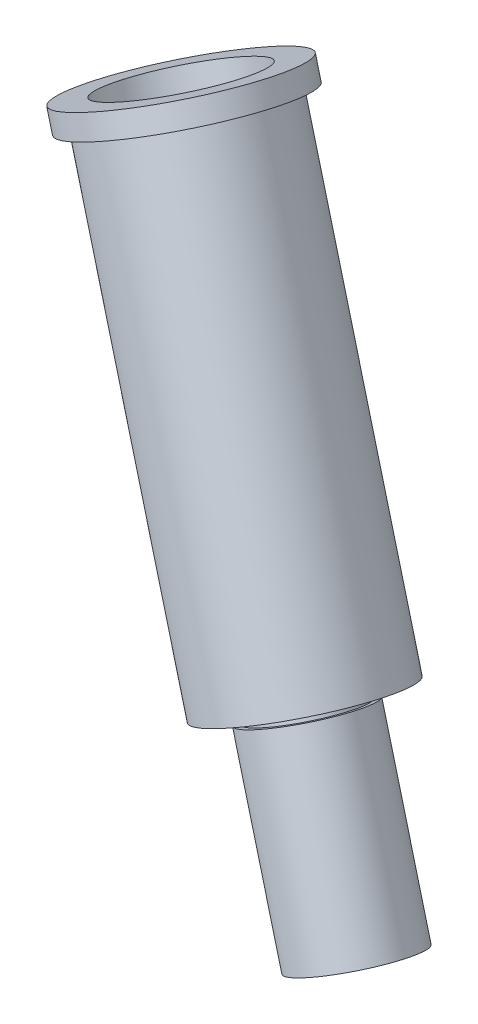
ISO-10303-21;
HEADER;
FILE_DESCRIPTION(('STEP AP214'),'2;1');
FILE_NAME('part.step','',(''),(''),'','','');
FILE_SCHEMA(('AUTOMOTIVE_DESIGN { 1 0 10303 214 1 1 1 1 }'));
ENDSEC;
DATA;
#1=APPLICATION_CONTEXT('core data for automotive mechanical design processes');
#2=APPLICATION_PROTOCOL_DEFINITION('international standard','automotive_design',2000,#1);
#3=PRODUCT_CONTEXT('',#1,'mechanical');
#4=PRODUCT('Part','Part','',(#3));
#5=PRODUCT_RELATED_PRODUCT_CATEGORY('part','',(#4));
#6=PRODUCT_DEFINITION_FORMATION('','',#4);
#7=PRODUCT_DEFINITION_CONTEXT('part definition',#1,'design');
#8=PRODUCT_DEFINITION('design','',#6,#7);
#9=PRODUCT_DEFINITION_SHAPE('','',#8);
#10=(LENGTH_UNIT() NAMED_UNIT(*) SI_UNIT(.MILLI.,.METRE.));
#11=(NAMED_UNIT(*) PLANE_ANGLE_UNIT() SI_UNIT($,.RADIAN.));
#12=(NAMED_UNIT(*) SI_UNIT($,.STERADIAN.) SOLID_ANGLE_UNIT());
#13=UNCERTAINTY_MEASURE_WITH_UNIT(LENGTH_MEASURE(1.E-05),#10,'distance_accuracy_value','');
#14=(GEOMETRIC_REPRESENTATION_CONTEXT(3) GLOBAL_UNCERTAINTY_ASSIGNED_CONTEXT((#13)) GLOBAL_UNIT_ASSIGNED_CONTEXT((#10,
#11,#12)) REPRESENTATION_CONTEXT('',''));
#15=CARTESIAN_POINT('',(0.,0.,0.));
#16=DIRECTION('',(0.,0.,1.));
#17=DIRECTION('',(1.,0.,0.));
#18=AXIS2_PLACEMENT_3D('',#15,#16,#17);
#19=CARTESIAN_POINT('',(-117.25238472882,178.239423952009,-1.86580613303616));
#20=DIRECTION('',(-0.447686282573601,0.877060581369753,-0.174188774043509));
#21=DIRECTION('',(-0.89067700354147,-0.454636641024883,0.));
#22=AXIS2_PLACEMENT_3D('',#19,#20,#21);
#23=CYLINDRICAL_SURFACE('',#22,3.17500000000134);
#24=CARTESIAN_POINT('',(-120.075761756659,183.770691703227,-2.96434455667218));
#25=DIRECTION('',(0.447686282573601,-0.877060581369753,0.174188774043509));
#26=DIRECTION('',(0.89067700354147,0.454636641024883,0.));
#27=AXIS2_PLACEMENT_3D('',#24,#25,#26);
#28=CIRCLE('',#27,3.17500000000134);
#29=CARTESIAN_POINT('',(-117.247862270413,185.214163038482,-2.96434455667218));
#30=VERTEX_POINT('',#29);
#31=EDGE_CURVE('E78',#30,#30,#28,.T.);
#32=ORIENTED_EDGE('',*,*,#31,.T.);
#33=EDGE_LOOP('',(#32));
#34=FACE_BOUND('',#33,.T.);
#35=CARTESIAN_POINT('',(-136.905184491165,216.741153078079,-9.51244895051574));
#36=DIRECTION('',(-0.447686282573601,0.877060581369753,-0.174188774043509));
#37=DIRECTION('',(-0.89067700354147,-0.454636641024883,0.));
#38=AXIS2_PLACEMENT_3D('',#35,#36,#37);
#39=CIRCLE('',#38,3.17500000000134);
#40=CARTESIAN_POINT('',(-139.733083977411,215.297681742824,-9.51244895051574));
#41=VERTEX_POINT('',#40);
#42=EDGE_CURVE('E51',#41,#41,#39,.F.);
#43=ORIENTED_EDGE('',*,*,#42,.F.);
#44=EDGE_LOOP('',(#43));
#45=FACE_BOUND('',#44,.T.);
#46=ADVANCED_FACE('F47',(#34,#45),#23,.F.);
#47=CARTESIAN_POINT('',(-153.962031857217,250.157161228268,-16.1490412415716));
#48=DIRECTION('',(0.447686282573601,-0.877060581369753,0.17418877404351));
#49=DIRECTION('',(0.89067700354147,0.454636641024883,0.));
#50=AXIS2_PLACEMENT_3D('',#47,#48,#49);
#51=CYLINDRICAL_SURFACE('',#50,11.43);
#52=CARTESIAN_POINT('',(-153.962031857217,250.157161228268,-16.1490412415716));
#53=DIRECTION('',(-0.447686282573601,0.877060581369753,-0.17418877404351));
#54=DIRECTION('',(-0.89067700354147,-0.454636641024883,0.));
#55=AXIS2_PLACEMENT_3D('',#52,#53,#54);
#56=CIRCLE('',#55,11.43);
#57=CARTESIAN_POINT('',(-164.142470007696,244.960664421354,-16.1490412415716));
#58=VERTEX_POINT('',#57);
#59=EDGE_CURVE('E62',#58,#58,#56,.T.);
#60=ORIENTED_EDGE('',*,*,#59,.F.);
#61=EDGE_LOOP('',(#60));
#62=FACE_BOUND('',#61,.T.);
#63=CARTESIAN_POINT('',(-152.82490869948,247.929427351589,-15.7066017555011));
#64=DIRECTION('',(-0.447686282573601,0.877060581369753,-0.17418877404351));
#65=DIRECTION('',(-0.89067700354147,-0.454636641024883,0.));
#66=AXIS2_PLACEMENT_3D('',#63,#64,#65);
#67=CIRCLE('',#66,11.43);
#68=CARTESIAN_POINT('',(-163.005346849959,242.732930544675,-15.7066017555011));
#69=VERTEX_POINT('',#68);
#70=EDGE_CURVE('E72',#69,#69,#67,.T.);
#71=ORIENTED_EDGE('',*,*,#70,.T.);
#72=EDGE_LOOP('',(#71));
#73=FACE_BOUND('',#72,.T.);
#74=ADVANCED_FACE('F49',(#62,#73),#51,.T.);
#75=CARTESIAN_POINT('',(-153.962031857217,250.157161228268,-16.1490412415716));
#76=DIRECTION('',(-0.447686282573601,0.877060581369753,-0.17418877404351));
#77=DIRECTION('',(-0.89067700354147,-0.454636641024883,0.));
#78=AXIS2_PLACEMENT_3D('',#75,#76,#77);
#79=PLANE('',#78);
#80=CARTESIAN_POINT('',(-153.962031857217,250.157161228268,-16.1490412415716));
#81=DIRECTION('',(-0.447686282573601,0.877060581369753,-0.174188774043509));
#82=DIRECTION('',(-0.89067700354147,-0.454636641024883,0.));
#83=AXIS2_PLACEMENT_3D('',#80,#81,#82);
#84=CIRCLE('',#83,7.9375);
#85=CARTESIAN_POINT('',(-161.031780572828,246.548482890133,-16.1490412415716));
#86=VERTEX_POINT('',#85);
#87=EDGE_CURVE('E94',#86,#86,#84,.T.);
#88=ORIENTED_EDGE('',*,*,#87,.F.);
#89=EDGE_LOOP('',(#88));
#90=FACE_BOUND('',#89,.T.);
#91=ORIENTED_EDGE('',*,*,#59,.T.);
#92=EDGE_LOOP('',(#91));
#93=FACE_BOUND('',#92,.T.);
#94=ADVANCED_FACE('F135',(#90,#93),#79,.T.);
#95=CARTESIAN_POINT('',(-152.82490869948,247.929427351589,-15.7066017555011));
#96=DIRECTION('',(-0.447686282573601,0.877060581369753,-0.17418877404351));
#97=DIRECTION('',(-0.89067700354147,-0.454636641024883,0.));
#98=AXIS2_PLACEMENT_3D('',#95,#96,#97);
#99=PLANE('',#98);
#100=CARTESIAN_POINT('',(-152.82490869948,247.929427351589,-15.7066017555011));
#101=DIRECTION('',(0.447686282573601,-0.877060581369753,0.17418877404351));
#102=DIRECTION('',(0.89067700354147,0.454636641024883,0.));
#103=AXIS2_PLACEMENT_3D('',#100,#101,#102);
#104=CIRCLE('',#103,9.99490000000001);
#105=CARTESIAN_POINT('',(-143.922681116784,252.473475114969,-15.7066017555011));
#106=VERTEX_POINT('',#105);
#107=EDGE_CURVE('E56',#106,#106,#104,.T.);
#108=ORIENTED_EDGE('',*,*,#107,.F.);
#109=EDGE_LOOP('',(#108));
#110=FACE_BOUND('',#109,.T.);
#111=ORIENTED_EDGE('',*,*,#70,.F.);
#112=EDGE_LOOP('',(#111));
#113=FACE_BOUND('',#112,.T.);
#114=ADVANCED_FACE('F159',(#110,#113),#99,.F.);
#115=CARTESIAN_POINT('',(-117.426423159589,178.580382013973,-1.93352217007332));
#116=DIRECTION('',(-0.447686282573601,0.877060581369753,-0.17418877404351));
#117=DIRECTION('',(-0.89067700354147,-0.454636641024883,0.));
#118=AXIS2_PLACEMENT_3D('',#115,#116,#117);
#119=CYLINDRICAL_SURFACE('',#118,9.99490000000001);
#120=CARTESIAN_POINT('',(-130.082445544741,203.374749818006,-6.85781203409081));
#121=DIRECTION('',(-0.447686282573601,0.877060581369753,-0.174188774043509));
#122=DIRECTION('',(-0.89067700354147,-0.454636641024883,0.));
#123=AXIS2_PLACEMENT_3D('',#120,#121,#122);
#124=CIRCLE('',#123,9.99490000000001);
#125=CARTESIAN_POINT('',(-138.984673127438,198.830702054626,-6.85781203409081));
#126=VERTEX_POINT('',#125);
#127=EDGE_CURVE('E68',#126,#126,#124,.T.);
#128=ORIENTED_EDGE('',*,*,#127,.T.);
#129=EDGE_LOOP('',(#128));
#130=FACE_BOUND('',#129,.T.);
#131=ORIENTED_EDGE('',*,*,#107,.T.);
#132=EDGE_LOOP('',(#131));
#133=FACE_BOUND('',#132,.T.);
#134=ADVANCED_FACE('F125',(#130,#133),#119,.T.);
#135=CARTESIAN_POINT('',(-130.082445544741,203.374749818006,-6.8578120340908));
#136=DIRECTION('',(-0.447686282573601,0.877060581369753,-0.174188774043509));
#137=DIRECTION('',(-0.46443243605247,-0.394533118102093,-0.792872077363687));
#138=AXIS2_PLACEMENT_3D('',#135,#136,#137);
#139=PLANE('',#138);
#140=CARTESIAN_POINT('',(-130.082445544744,203.374749818004,-6.85781203409266));
#141=DIRECTION('',(0.447686282573601,-0.877060581369753,0.174188774043509));
#142=DIRECTION('',(0.89067700354147,0.454636641024883,0.));
#143=AXIS2_PLACEMENT_3D('',#140,#141,#142);
#144=CIRCLE('',#143,5.71499999999721);
#145=CARTESIAN_POINT('',(-124.992226469507,205.97299822146,-6.85781203409266));
#146=VERTEX_POINT('',#145);
#147=EDGE_CURVE('E10',#146,#146,#144,.T.);
#148=ORIENTED_EDGE('',*,*,#147,.F.);
#149=EDGE_LOOP('',(#148));
#150=FACE_BOUND('',#149,.T.);
#151=ORIENTED_EDGE('',*,*,#127,.F.);
#152=EDGE_LOOP('',(#151));
#153=FACE_BOUND('',#152,.T.);
#154=ADVANCED_FACE('F116',(#150,#153),#139,.F.);
#155=CARTESIAN_POINT('',(-129.627596281649,202.483656267332,-6.68083623966445));
#156=DIRECTION('',(-0.447686282573601,0.877060581369753,-0.174188774043509));
#157=DIRECTION('',(-0.89067700354147,-0.454636641024883,0.));
#158=AXIS2_PLACEMENT_3D('',#155,#156,#157);
#159=CYLINDRICAL_SURFACE('',#158,5.71499999999721);
#160=CARTESIAN_POINT('',(-129.627596281649,202.483656267332,-6.68083623966445));
#161=DIRECTION('',(0.447686282573601,-0.877060581369753,0.174188774043509));
#162=DIRECTION('',(0.89067700354147,0.454636641024883,0.));
#163=AXIS2_PLACEMENT_3D('',#160,#161,#162);
#164=CIRCLE('',#163,5.71499999999721);
#165=CARTESIAN_POINT('',(-124.537377206412,205.081904670788,-6.68083623966445));
#166=VERTEX_POINT('',#165);
#167=EDGE_CURVE('E65',#166,#166,#164,.T.);
#168=ORIENTED_EDGE('',*,*,#167,.F.);
#169=EDGE_LOOP('',(#168));
#170=FACE_BOUND('',#169,.T.);
#171=ORIENTED_EDGE('',*,*,#147,.T.);
#172=EDGE_LOOP('',(#171));
#173=FACE_BOUND('',#172,.T.);
#174=ADVANCED_FACE('F113',(#170,#173),#159,.T.);
#175=CARTESIAN_POINT('',(-120.075761756656,183.770691703229,-2.96434455667031));
#176=DIRECTION('',(-0.447686282573601,0.877060581369753,-0.17418877404351));
#177=DIRECTION('',(-0.89067700354147,-0.454636641024883,0.));
#178=AXIS2_PLACEMENT_3D('',#175,#176,#177);
#179=CYLINDRICAL_SURFACE('',#178,6.34999999999999);
#180=CARTESIAN_POINT('',(-120.075761756656,183.770691703229,-2.96434455667031));
#181=DIRECTION('',(0.447686282573601,-0.877060581369753,0.174188774043509));
#182=DIRECTION('',(0.89067700354147,0.454636641024883,0.));
#183=AXIS2_PLACEMENT_3D('',#180,#181,#182);
#184=CIRCLE('',#183,6.34999999999999);
#185=CARTESIAN_POINT('',(-114.419962784168,186.657634373737,-2.96434455667031));
#186=VERTEX_POINT('',#185);
#187=EDGE_CURVE('E87',#186,#186,#184,.T.);
#188=ORIENTED_EDGE('',*,*,#187,.F.);
#189=EDGE_LOOP('',(#188));
#190=FACE_BOUND('',#189,.T.);
#191=CARTESIAN_POINT('',(-129.627596281647,202.483656267334,-6.68083623966263));
#192=DIRECTION('',(0.447686282573601,-0.877060581369753,0.174188774043509));
#193=DIRECTION('',(0.89067700354147,0.454636641024883,0.));
#194=AXIS2_PLACEMENT_3D('',#191,#192,#193);
#195=CIRCLE('',#194,6.34999999999999);
#196=CARTESIAN_POINT('',(-123.971797309158,205.370598937842,-6.68083623966263));
#197=VERTEX_POINT('',#196);
#198=EDGE_CURVE('E81',#197,#197,#195,.T.);
#199=ORIENTED_EDGE('',*,*,#198,.T.);
#200=EDGE_LOOP('',(#199));
#201=FACE_BOUND('',#200,.T.);
#202=ADVANCED_FACE('F115',(#190,#201),#179,.T.);
#203=CARTESIAN_POINT('',(-120.075761756656,183.770691703229,-2.96434455667031));
#204=DIRECTION('',(0.447686282573601,-0.877060581369753,0.174188774043509));
#205=DIRECTION('',(0.89067700354147,0.454636641024883,0.));
#206=AXIS2_PLACEMENT_3D('',#203,#204,#205);
#207=PLANE('',#206);
#208=ORIENTED_EDGE('',*,*,#31,.F.);
#209=EDGE_LOOP('',(#208));
#210=FACE_BOUND('',#209,.T.);
#211=ORIENTED_EDGE('',*,*,#187,.T.);
#212=EDGE_LOOP('',(#211));
#213=FACE_BOUND('',#212,.T.);
#214=ADVANCED_FACE('F122',(#210,#213),#207,.T.);
#215=CARTESIAN_POINT('',(-129.627596281647,202.483656267334,-6.68083623966263));
#216=DIRECTION('',(0.447686282573601,-0.877060581369753,0.174188774043509));
#217=DIRECTION('',(0.89067700354147,0.454636641024883,0.));
#218=AXIS2_PLACEMENT_3D('',#215,#216,#217);
#219=PLANE('',#218);
#220=ORIENTED_EDGE('',*,*,#167,.T.);
#221=EDGE_LOOP('',(#220));
#222=FACE_BOUND('',#221,.T.);
#223=ORIENTED_EDGE('',*,*,#198,.F.);
#224=EDGE_LOOP('',(#223));
#225=FACE_BOUND('',#224,.T.);
#226=ADVANCED_FACE('F110',(#222,#225),#219,.F.);
#227=CARTESIAN_POINT('',(-136.905184491163,216.741153078081,-9.51244895051389));
#228=DIRECTION('',(-0.447686282573601,0.877060581369753,-0.174188774043509));
#229=DIRECTION('',(-0.89067700354147,-0.454636641024883,0.));
#230=AXIS2_PLACEMENT_3D('',#227,#228,#229);
#231=PLANE('',#230);
#232=CARTESIAN_POINT('',(-136.905184491163,216.741153078081,-9.51244895051389));
#233=DIRECTION('',(-0.447686282573601,0.877060581369753,-0.174188774043509));
#234=DIRECTION('',(-0.89067700354147,-0.454636641024883,0.));
#235=AXIS2_PLACEMENT_3D('',#232,#233,#234);
#236=CIRCLE('',#235,7.9375);
#237=CARTESIAN_POINT('',(-143.974933206773,213.132474739946,-9.51244895051389));
#238=VERTEX_POINT('',#237);
#239=EDGE_CURVE('E89',#238,#238,#236,.T.);
#240=ORIENTED_EDGE('',*,*,#239,.T.);
#241=EDGE_LOOP('',(#240));
#242=FACE_BOUND('',#241,.T.);
#243=ORIENTED_EDGE('',*,*,#42,.T.);
#244=EDGE_LOOP('',(#243));
#245=FACE_BOUND('',#244,.T.);
#246=ADVANCED_FACE('F145',(#242,#245),#231,.T.);
#247=CARTESIAN_POINT('',(-136.905184491163,216.741153078081,-9.51244895051389));
#248=DIRECTION('',(-0.447686282573601,0.877060581369753,-0.174188774043509));
#249=DIRECTION('',(-0.89067700354147,-0.454636641024883,0.));
#250=AXIS2_PLACEMENT_3D('',#247,#248,#249);
#251=CYLINDRICAL_SURFACE('',#250,7.9375);
#252=ORIENTED_EDGE('',*,*,#239,.F.);
#253=EDGE_LOOP('',(#252));
#254=FACE_BOUND('',#253,.T.);
#255=ORIENTED_EDGE('',*,*,#87,.T.);
#256=EDGE_LOOP('',(#255));
#257=FACE_BOUND('',#256,.T.);
#258=ADVANCED_FACE('F140',(#254,#257),#251,.F.);
#259=CLOSED_SHELL('',(#46,#74,#94,#114,#134,#154,#174,#202,#214,#226,#246,#258));
#260=MANIFOLD_SOLID_BREP('B2',#259);
#261=ADVANCED_BREP_SHAPE_REPRESENTATION('',(#18,#260),#14);
#262=SHAPE_DEFINITION_REPRESENTATION(#9,#261);
ENDSEC;
END-ISO-10303-21;
